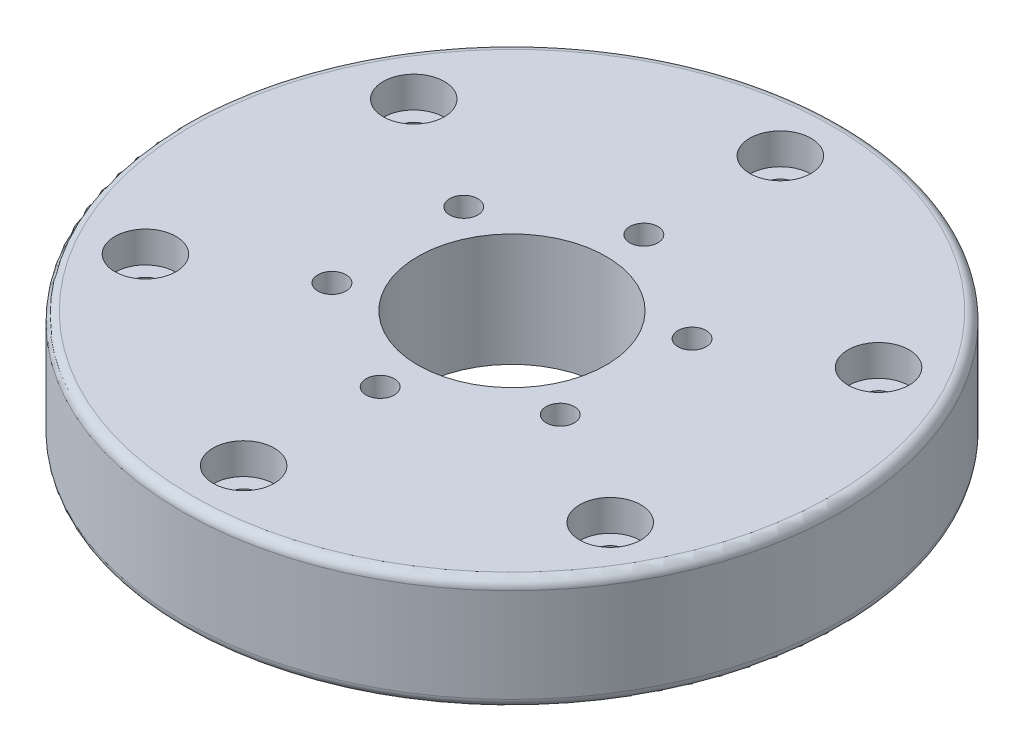
ISO-10303-21;
HEADER;
FILE_DESCRIPTION(('STEP AP214'),'2;1');
FILE_NAME('part.step','',(''),(''),'','','');
FILE_SCHEMA(('AUTOMOTIVE_DESIGN { 1 0 10303 214 1 1 1 1 }'));
ENDSEC;
DATA;
#1=APPLICATION_CONTEXT('core data for automotive mechanical design processes');
#2=APPLICATION_PROTOCOL_DEFINITION('international standard','automotive_design',2000,#1);
#3=PRODUCT_CONTEXT('',#1,'mechanical');
#4=PRODUCT('Part','Part','',(#3));
#5=PRODUCT_RELATED_PRODUCT_CATEGORY('part','',(#4));
#6=PRODUCT_DEFINITION_FORMATION('','',#4);
#7=PRODUCT_DEFINITION_CONTEXT('part definition',#1,'design');
#8=PRODUCT_DEFINITION('design','',#6,#7);
#9=PRODUCT_DEFINITION_SHAPE('','',#8);
#10=(LENGTH_UNIT() NAMED_UNIT(*) SI_UNIT(.MILLI.,.METRE.));
#11=(NAMED_UNIT(*) PLANE_ANGLE_UNIT() SI_UNIT($,.RADIAN.));
#12=(NAMED_UNIT(*) SI_UNIT($,.STERADIAN.) SOLID_ANGLE_UNIT());
#13=UNCERTAINTY_MEASURE_WITH_UNIT(LENGTH_MEASURE(1.E-05),#10,'distance_accuracy_value','');
#14=(GEOMETRIC_REPRESENTATION_CONTEXT(3) GLOBAL_UNCERTAINTY_ASSIGNED_CONTEXT((#13)) GLOBAL_UNIT_ASSIGNED_CONTEXT((#10,
#11,#12)) REPRESENTATION_CONTEXT('',''));
#15=CARTESIAN_POINT('',(0.,0.,0.));
#16=DIRECTION('',(0.,0.,1.));
#17=DIRECTION('',(1.,0.,0.));
#18=AXIS2_PLACEMENT_3D('',#15,#16,#17);
#19=CARTESIAN_POINT('',(24.6817240078563,8.7,-14.2500000000003));
#20=DIRECTION('',(0.,-1.,0.));
#21=DIRECTION('',(0.,0.,-1.));
#22=AXIS2_PLACEMENT_3D('',#19,#20,#21);
#23=PLANE('',#22);
#24=CARTESIAN_POINT('',(24.6817240078563,8.7,-14.2500000000003));
#25=DIRECTION('',(0.,1.,0.));
#26=DIRECTION('',(0.,0.,1.));
#27=AXIS2_PLACEMENT_3D('',#24,#25,#26);
#28=CIRCLE('',#27,3.25000000000001);
#29=CARTESIAN_POINT('',(24.6817240078563,8.7,-11.0000000000003));
#30=VERTEX_POINT('',#29);
#31=EDGE_CURVE('E87',#30,#30,#28,.T.);
#32=ORIENTED_EDGE('',*,*,#31,.T.);
#33=EDGE_LOOP('',(#32));
#34=FACE_BOUND('',#33,.T.);
#35=CARTESIAN_POINT('',(24.6817240078563,8.7,-14.2500000000003));
#36=DIRECTION('',(0.,1.,0.));
#37=DIRECTION('',(0.,0.,1.));
#38=AXIS2_PLACEMENT_3D('',#35,#36,#37);
#39=CIRCLE('',#38,1.65000000000001);
#40=CARTESIAN_POINT('',(24.6817240078563,8.7,-12.6000000000003));
#41=VERTEX_POINT('',#40);
#42=EDGE_CURVE('E126',#41,#41,#39,.T.);
#43=ORIENTED_EDGE('',*,*,#42,.F.);
#44=EDGE_LOOP('',(#43));
#45=FACE_BOUND('',#44,.T.);
#46=ADVANCED_FACE('F37',(#34,#45),#23,.F.);
#47=CARTESIAN_POINT('',(24.6817240078566,8.7,14.2499999999998));
#48=DIRECTION('',(0.,-1.,0.));
#49=DIRECTION('',(0.,0.,-1.));
#50=AXIS2_PLACEMENT_3D('',#47,#48,#49);
#51=PLANE('',#50);
#52=CARTESIAN_POINT('',(24.6817240078566,8.7,14.2499999999998));
#53=DIRECTION('',(0.,1.,0.));
#54=DIRECTION('',(0.,0.,1.));
#55=AXIS2_PLACEMENT_3D('',#52,#53,#54);
#56=CIRCLE('',#55,3.25000000000001);
#57=CARTESIAN_POINT('',(24.6817240078566,8.7,17.4999999999998));
#58=VERTEX_POINT('',#57);
#59=EDGE_CURVE('E81',#58,#58,#56,.T.);
#60=ORIENTED_EDGE('',*,*,#59,.T.);
#61=EDGE_LOOP('',(#60));
#62=FACE_BOUND('',#61,.T.);
#63=CARTESIAN_POINT('',(24.6817240078566,8.7,14.2499999999998));
#64=DIRECTION('',(0.,1.,0.));
#65=DIRECTION('',(0.,0.,1.));
#66=AXIS2_PLACEMENT_3D('',#63,#64,#65);
#67=CIRCLE('',#66,1.65000000000001);
#68=CARTESIAN_POINT('',(24.6817240078566,8.7,15.8999999999998));
#69=VERTEX_POINT('',#68);
#70=EDGE_CURVE('E120',#69,#69,#67,.T.);
#71=ORIENTED_EDGE('',*,*,#70,.F.);
#72=EDGE_LOOP('',(#71));
#73=FACE_BOUND('',#72,.T.);
#74=ADVANCED_FACE('F222',(#62,#73),#51,.F.);
#75=CARTESIAN_POINT('',(0.,8.7,28.5));
#76=DIRECTION('',(0.,-1.,0.));
#77=DIRECTION('',(0.,0.,-1.));
#78=AXIS2_PLACEMENT_3D('',#75,#76,#77);
#79=PLANE('',#78);
#80=CARTESIAN_POINT('',(0.,8.7,28.5));
#81=DIRECTION('',(0.,1.,0.));
#82=DIRECTION('',(0.,0.,1.));
#83=AXIS2_PLACEMENT_3D('',#80,#81,#82);
#84=CIRCLE('',#83,3.25000000000001);
#85=CARTESIAN_POINT('',(0.,8.7,31.75));
#86=VERTEX_POINT('',#85);
#87=EDGE_CURVE('E75',#86,#86,#84,.T.);
#88=ORIENTED_EDGE('',*,*,#87,.T.);
#89=EDGE_LOOP('',(#88));
#90=FACE_BOUND('',#89,.T.);
#91=CARTESIAN_POINT('',(0.,8.7,28.5));
#92=DIRECTION('',(0.,1.,0.));
#93=DIRECTION('',(0.,0.,1.));
#94=AXIS2_PLACEMENT_3D('',#91,#92,#93);
#95=CIRCLE('',#94,1.65000000000001);
#96=CARTESIAN_POINT('',(0.,8.7,30.15));
#97=VERTEX_POINT('',#96);
#98=EDGE_CURVE('E114',#97,#97,#95,.T.);
#99=ORIENTED_EDGE('',*,*,#98,.F.);
#100=EDGE_LOOP('',(#99));
#101=FACE_BOUND('',#100,.T.);
#102=ADVANCED_FACE('F229',(#90,#101),#79,.F.);
#103=CARTESIAN_POINT('',(-24.6817240078564,8.7,14.2500000000001));
#104=DIRECTION('',(0.,-1.,0.));
#105=DIRECTION('',(0.,0.,-1.));
#106=AXIS2_PLACEMENT_3D('',#103,#104,#105);
#107=PLANE('',#106);
#108=CARTESIAN_POINT('',(-24.6817240078564,8.7,14.2500000000001));
#109=DIRECTION('',(0.,1.,0.));
#110=DIRECTION('',(0.,0.,1.));
#111=AXIS2_PLACEMENT_3D('',#108,#109,#110);
#112=CIRCLE('',#111,3.25000000000001);
#113=CARTESIAN_POINT('',(-24.6817240078564,8.7,17.5000000000001));
#114=VERTEX_POINT('',#113);
#115=EDGE_CURVE('E69',#114,#114,#112,.T.);
#116=ORIENTED_EDGE('',*,*,#115,.T.);
#117=EDGE_LOOP('',(#116));
#118=FACE_BOUND('',#117,.T.);
#119=CARTESIAN_POINT('',(-24.6817240078564,8.7,14.2500000000001));
#120=DIRECTION('',(0.,1.,0.));
#121=DIRECTION('',(0.,0.,1.));
#122=AXIS2_PLACEMENT_3D('',#119,#120,#121);
#123=CIRCLE('',#122,1.65000000000001);
#124=CARTESIAN_POINT('',(-24.6817240078564,8.7,15.9000000000001));
#125=VERTEX_POINT('',#124);
#126=EDGE_CURVE('E108',#125,#125,#123,.T.);
#127=ORIENTED_EDGE('',*,*,#126,.F.);
#128=EDGE_LOOP('',(#127));
#129=FACE_BOUND('',#128,.T.);
#130=ADVANCED_FACE('F247',(#118,#129),#107,.F.);
#131=CARTESIAN_POINT('',(-24.6817240078565,8.7,-14.2499999999999));
#132=DIRECTION('',(0.,-1.,0.));
#133=DIRECTION('',(0.,0.,-1.));
#134=AXIS2_PLACEMENT_3D('',#131,#132,#133);
#135=PLANE('',#134);
#136=CARTESIAN_POINT('',(-24.6817240078565,8.7,-14.2499999999999));
#137=DIRECTION('',(0.,1.,0.));
#138=DIRECTION('',(0.,0.,1.));
#139=AXIS2_PLACEMENT_3D('',#136,#137,#138);
#140=CIRCLE('',#139,3.25000000000001);
#141=CARTESIAN_POINT('',(-24.6817240078565,8.7,-10.9999999999999));
#142=VERTEX_POINT('',#141);
#143=EDGE_CURVE('E63',#142,#142,#140,.T.);
#144=ORIENTED_EDGE('',*,*,#143,.T.);
#145=EDGE_LOOP('',(#144));
#146=FACE_BOUND('',#145,.T.);
#147=CARTESIAN_POINT('',(-24.6817240078565,8.7,-14.2499999999999));
#148=DIRECTION('',(0.,1.,0.));
#149=DIRECTION('',(0.,0.,1.));
#150=AXIS2_PLACEMENT_3D('',#147,#148,#149);
#151=CIRCLE('',#150,1.65000000000001);
#152=CARTESIAN_POINT('',(-24.6817240078565,8.7,-12.5999999999999));
#153=VERTEX_POINT('',#152);
#154=EDGE_CURVE('E102',#153,#153,#151,.T.);
#155=ORIENTED_EDGE('',*,*,#154,.F.);
#156=EDGE_LOOP('',(#155));
#157=FACE_BOUND('',#156,.T.);
#158=ADVANCED_FACE('F253',(#146,#157),#135,.F.);
#159=CARTESIAN_POINT('',(0.,12.,0.));
#160=DIRECTION('',(0.,-1.,0.));
#161=DIRECTION('',(0.,0.,-1.));
#162=AXIS2_PLACEMENT_3D('',#159,#160,#161);
#163=CYLINDRICAL_SURFACE('',#162,35.);
#164=CARTESIAN_POINT('',(0.,1.,0.));
#165=DIRECTION('',(0.,1.,0.));
#166=DIRECTION('',(0.,0.,1.));
#167=AXIS2_PLACEMENT_3D('',#164,#165,#166);
#168=CIRCLE('',#167,35.);
#169=CARTESIAN_POINT('',(0.,1.,35.));
#170=VERTEX_POINT('',#169);
#171=EDGE_CURVE('E48',#170,#170,#168,.T.);
#172=ORIENTED_EDGE('',*,*,#171,.T.);
#173=EDGE_LOOP('',(#172));
#174=FACE_BOUND('',#173,.T.);
#175=CARTESIAN_POINT('',(0.,11.,0.));
#176=DIRECTION('',(0.,1.,0.));
#177=DIRECTION('',(0.,0.,1.));
#178=AXIS2_PLACEMENT_3D('',#175,#176,#177);
#179=CIRCLE('',#178,35.);
#180=CARTESIAN_POINT('',(0.,11.,35.));
#181=VERTEX_POINT('',#180);
#182=EDGE_CURVE('E52',#181,#181,#179,.F.);
#183=ORIENTED_EDGE('',*,*,#182,.T.);
#184=EDGE_LOOP('',(#183));
#185=FACE_BOUND('',#184,.T.);
#186=ADVANCED_FACE('F177',(#174,#185),#163,.T.);
#187=CARTESIAN_POINT('',(0.,12.,0.));
#188=DIRECTION('',(0.,1.,0.));
#189=DIRECTION('',(0.,0.,1.));
#190=AXIS2_PLACEMENT_3D('',#187,#188,#189);
#191=PLANE('',#190);
#192=CARTESIAN_POINT('',(0.,12.,0.));
#193=DIRECTION('',(0.,1.,0.));
#194=DIRECTION('',(0.,0.,1.));
#195=AXIS2_PLACEMENT_3D('',#192,#193,#194);
#196=CIRCLE('',#195,10.);
#197=CARTESIAN_POINT('',(0.,12.,10.));
#198=VERTEX_POINT('',#197);
#199=EDGE_CURVE('E168',#198,#198,#196,.T.);
#200=ORIENTED_EDGE('',*,*,#199,.F.);
#201=EDGE_LOOP('',(#200));
#202=FACE_BOUND('',#201,.T.);
#203=CARTESIAN_POINT('',(0.,12.,0.));
#204=DIRECTION('',(0.,1.,0.));
#205=DIRECTION('',(0.,0.,1.));
#206=AXIS2_PLACEMENT_3D('',#203,#204,#205);
#207=CIRCLE('',#206,34.);
#208=CARTESIAN_POINT('',(0.,12.,34.));
#209=VERTEX_POINT('',#208);
#210=EDGE_CURVE('E10',#209,#209,#207,.T.);
#211=ORIENTED_EDGE('',*,*,#210,.T.);
#212=EDGE_LOOP('',(#211));
#213=FACE_BOUND('',#212,.T.);
#214=CARTESIAN_POINT('',(12.1243556529821,12.,-7.00000000000014));
#215=DIRECTION('',(0.,1.,0.));
#216=DIRECTION('',(0.,0.,1.));
#217=AXIS2_PLACEMENT_3D('',#214,#215,#216);
#218=CIRCLE('',#217,1.50000000000001);
#219=CARTESIAN_POINT('',(12.1243556529821,12.,-5.50000000000013));
#220=VERTEX_POINT('',#219);
#221=EDGE_CURVE('E162',#220,#220,#218,.T.);
#222=ORIENTED_EDGE('',*,*,#221,.F.);
#223=EDGE_LOOP('',(#222));
#224=FACE_BOUND('',#223,.T.);
#225=CARTESIAN_POINT('',(12.1243556529822,12.,6.99999999999989));
#226=DIRECTION('',(0.,1.,0.));
#227=DIRECTION('',(0.,0.,1.));
#228=AXIS2_PLACEMENT_3D('',#225,#226,#227);
#229=CIRCLE('',#228,1.50000000000001);
#230=CARTESIAN_POINT('',(12.1243556529822,12.,8.4999999999999));
#231=VERTEX_POINT('',#230);
#232=EDGE_CURVE('E156',#231,#231,#229,.T.);
#233=ORIENTED_EDGE('',*,*,#232,.F.);
#234=EDGE_LOOP('',(#233));
#235=FACE_BOUND('',#234,.T.);
#236=CARTESIAN_POINT('',(0.,12.,14.));
#237=DIRECTION('',(0.,1.,0.));
#238=DIRECTION('',(0.,0.,1.));
#239=AXIS2_PLACEMENT_3D('',#236,#237,#238);
#240=CIRCLE('',#239,1.50000000000001);
#241=CARTESIAN_POINT('',(0.,12.,15.5));
#242=VERTEX_POINT('',#241);
#243=EDGE_CURVE('E150',#242,#242,#240,.T.);
#244=ORIENTED_EDGE('',*,*,#243,.F.);
#245=EDGE_LOOP('',(#244));
#246=FACE_BOUND('',#245,.T.);
#247=CARTESIAN_POINT('',(-12.1243556529821,12.,7.00000000000006));
#248=DIRECTION('',(0.,1.,0.));
#249=DIRECTION('',(0.,0.,1.));
#250=AXIS2_PLACEMENT_3D('',#247,#248,#249);
#251=CIRCLE('',#250,1.50000000000001);
#252=CARTESIAN_POINT('',(-12.1243556529821,12.,8.50000000000007));
#253=VERTEX_POINT('',#252);
#254=EDGE_CURVE('E144',#253,#253,#251,.T.);
#255=ORIENTED_EDGE('',*,*,#254,.F.);
#256=EDGE_LOOP('',(#255));
#257=FACE_BOUND('',#256,.T.);
#258=CARTESIAN_POINT('',(-12.1243556529822,12.,-6.99999999999997));
#259=DIRECTION('',(0.,1.,0.));
#260=DIRECTION('',(0.,0.,1.));
#261=AXIS2_PLACEMENT_3D('',#258,#259,#260);
#262=CIRCLE('',#261,1.50000000000001);
#263=CARTESIAN_POINT('',(-12.1243556529822,12.,-5.49999999999996));
#264=VERTEX_POINT('',#263);
#265=EDGE_CURVE('E138',#264,#264,#262,.T.);
#266=ORIENTED_EDGE('',*,*,#265,.F.);
#267=EDGE_LOOP('',(#266));
#268=FACE_BOUND('',#267,.T.);
#269=CARTESIAN_POINT('',(0.,12.,-14.));
#270=DIRECTION('',(0.,1.,0.));
#271=DIRECTION('',(0.,0.,1.));
#272=AXIS2_PLACEMENT_3D('',#269,#270,#271);
#273=CIRCLE('',#272,1.50000000000001);
#274=CARTESIAN_POINT('',(0.,12.,-12.5));
#275=VERTEX_POINT('',#274);
#276=EDGE_CURVE('E132',#275,#275,#273,.T.);
#277=ORIENTED_EDGE('',*,*,#276,.F.);
#278=EDGE_LOOP('',(#277));
#279=FACE_BOUND('',#278,.T.);
#280=CARTESIAN_POINT('',(24.6817240078563,12.,-14.2500000000003));
#281=DIRECTION('',(0.,1.,0.));
#282=DIRECTION('',(0.,0.,1.));
#283=AXIS2_PLACEMENT_3D('',#280,#281,#282);
#284=CIRCLE('',#283,3.25000000000001);
#285=CARTESIAN_POINT('',(24.6817240078563,12.,-11.0000000000003));
#286=VERTEX_POINT('',#285);
#287=EDGE_CURVE('E90',#286,#286,#284,.T.);
#288=ORIENTED_EDGE('',*,*,#287,.F.);
#289=EDGE_LOOP('',(#288));
#290=FACE_BOUND('',#289,.T.);
#291=CARTESIAN_POINT('',(24.6817240078566,12.,14.2499999999998));
#292=DIRECTION('',(0.,1.,0.));
#293=DIRECTION('',(0.,0.,1.));
#294=AXIS2_PLACEMENT_3D('',#291,#292,#293);
#295=CIRCLE('',#294,3.25000000000001);
#296=CARTESIAN_POINT('',(24.6817240078566,12.,17.4999999999998));
#297=VERTEX_POINT('',#296);
#298=EDGE_CURVE('E84',#297,#297,#295,.T.);
#299=ORIENTED_EDGE('',*,*,#298,.F.);
#300=EDGE_LOOP('',(#299));
#301=FACE_BOUND('',#300,.T.);
#302=CARTESIAN_POINT('',(0.,12.,28.5));
#303=DIRECTION('',(0.,1.,0.));
#304=DIRECTION('',(0.,0.,1.));
#305=AXIS2_PLACEMENT_3D('',#302,#303,#304);
#306=CIRCLE('',#305,3.25000000000001);
#307=CARTESIAN_POINT('',(0.,12.,31.75));
#308=VERTEX_POINT('',#307);
#309=EDGE_CURVE('E78',#308,#308,#306,.T.);
#310=ORIENTED_EDGE('',*,*,#309,.F.);
#311=EDGE_LOOP('',(#310));
#312=FACE_BOUND('',#311,.T.);
#313=CARTESIAN_POINT('',(-24.6817240078564,12.,14.2500000000001));
#314=DIRECTION('',(0.,1.,0.));
#315=DIRECTION('',(0.,0.,1.));
#316=AXIS2_PLACEMENT_3D('',#313,#314,#315);
#317=CIRCLE('',#316,3.25000000000001);
#318=CARTESIAN_POINT('',(-24.6817240078564,12.,17.5000000000001));
#319=VERTEX_POINT('',#318);
#320=EDGE_CURVE('E72',#319,#319,#317,.T.);
#321=ORIENTED_EDGE('',*,*,#320,.F.);
#322=EDGE_LOOP('',(#321));
#323=FACE_BOUND('',#322,.T.);
#324=CARTESIAN_POINT('',(-24.6817240078565,12.,-14.2499999999999));
#325=DIRECTION('',(0.,1.,0.));
#326=DIRECTION('',(0.,0.,1.));
#327=AXIS2_PLACEMENT_3D('',#324,#325,#326);
#328=CIRCLE('',#327,3.25000000000001);
#329=CARTESIAN_POINT('',(-24.6817240078565,12.,-10.9999999999999));
#330=VERTEX_POINT('',#329);
#331=EDGE_CURVE('E66',#330,#330,#328,.T.);
#332=ORIENTED_EDGE('',*,*,#331,.F.);
#333=EDGE_LOOP('',(#332));
#334=FACE_BOUND('',#333,.T.);
#335=CARTESIAN_POINT('',(0.,12.,-28.5));
#336=DIRECTION('',(0.,1.,0.));
#337=DIRECTION('',(0.,0.,1.));
#338=AXIS2_PLACEMENT_3D('',#335,#336,#337);
#339=CIRCLE('',#338,3.25000000000001);
#340=CARTESIAN_POINT('',(0.,12.,-25.25));
#341=VERTEX_POINT('',#340);
#342=EDGE_CURVE('E60',#341,#341,#339,.T.);
#343=ORIENTED_EDGE('',*,*,#342,.F.);
#344=EDGE_LOOP('',(#343));
#345=FACE_BOUND('',#344,.T.);
#346=ADVANCED_FACE('F174',(#202,#213,#224,#235,#246,#257,#268,#279,#290,#301,#312,#323,#334,
#345),#191,.T.);
#347=CARTESIAN_POINT('',(0.,0.,0.));
#348=DIRECTION('',(0.,1.,0.));
#349=DIRECTION('',(0.,0.,1.));
#350=AXIS2_PLACEMENT_3D('',#347,#348,#349);
#351=PLANE('',#350);
#352=CARTESIAN_POINT('',(0.,0.,0.));
#353=DIRECTION('',(0.,1.,0.));
#354=DIRECTION('',(0.,0.,1.));
#355=AXIS2_PLACEMENT_3D('',#352,#353,#354);
#356=CIRCLE('',#355,10.);
#357=CARTESIAN_POINT('',(0.,0.,10.));
#358=VERTEX_POINT('',#357);
#359=EDGE_CURVE('E165',#358,#358,#356,.T.);
#360=ORIENTED_EDGE('',*,*,#359,.T.);
#361=EDGE_LOOP('',(#360));
#362=FACE_BOUND('',#361,.T.);
#363=CARTESIAN_POINT('',(0.,0.,0.));
#364=DIRECTION('',(0.,1.,0.));
#365=DIRECTION('',(0.,0.,1.));
#366=AXIS2_PLACEMENT_3D('',#363,#364,#365);
#367=CIRCLE('',#366,34.);
#368=CARTESIAN_POINT('',(0.,0.,34.));
#369=VERTEX_POINT('',#368);
#370=EDGE_CURVE('E44',#369,#369,#367,.F.);
#371=ORIENTED_EDGE('',*,*,#370,.T.);
#372=EDGE_LOOP('',(#371));
#373=FACE_BOUND('',#372,.T.);
#374=CARTESIAN_POINT('',(12.1243556529821,0.,-7.00000000000014));
#375=DIRECTION('',(0.,1.,0.));
#376=DIRECTION('',(0.,0.,1.));
#377=AXIS2_PLACEMENT_3D('',#374,#375,#376);
#378=CIRCLE('',#377,1.50000000000001);
#379=CARTESIAN_POINT('',(12.1243556529821,0.,-5.50000000000013));
#380=VERTEX_POINT('',#379);
#381=EDGE_CURVE('E159',#380,#380,#378,.T.);
#382=ORIENTED_EDGE('',*,*,#381,.T.);
#383=EDGE_LOOP('',(#382));
#384=FACE_BOUND('',#383,.T.);
#385=CARTESIAN_POINT('',(12.1243556529822,0.,6.99999999999989));
#386=DIRECTION('',(0.,1.,0.));
#387=DIRECTION('',(0.,0.,1.));
#388=AXIS2_PLACEMENT_3D('',#385,#386,#387);
#389=CIRCLE('',#388,1.50000000000001);
#390=CARTESIAN_POINT('',(12.1243556529822,0.,8.4999999999999));
#391=VERTEX_POINT('',#390);
#392=EDGE_CURVE('E153',#391,#391,#389,.T.);
#393=ORIENTED_EDGE('',*,*,#392,.T.);
#394=EDGE_LOOP('',(#393));
#395=FACE_BOUND('',#394,.T.);
#396=CARTESIAN_POINT('',(0.,0.,14.));
#397=DIRECTION('',(0.,1.,0.));
#398=DIRECTION('',(0.,0.,1.));
#399=AXIS2_PLACEMENT_3D('',#396,#397,#398);
#400=CIRCLE('',#399,1.50000000000001);
#401=CARTESIAN_POINT('',(0.,0.,15.5));
#402=VERTEX_POINT('',#401);
#403=EDGE_CURVE('E147',#402,#402,#400,.T.);
#404=ORIENTED_EDGE('',*,*,#403,.T.);
#405=EDGE_LOOP('',(#404));
#406=FACE_BOUND('',#405,.T.);
#407=CARTESIAN_POINT('',(-12.1243556529821,0.,7.00000000000006));
#408=DIRECTION('',(0.,1.,0.));
#409=DIRECTION('',(0.,0.,1.));
#410=AXIS2_PLACEMENT_3D('',#407,#408,#409);
#411=CIRCLE('',#410,1.50000000000001);
#412=CARTESIAN_POINT('',(-12.1243556529821,0.,8.50000000000007));
#413=VERTEX_POINT('',#412);
#414=EDGE_CURVE('E141',#413,#413,#411,.T.);
#415=ORIENTED_EDGE('',*,*,#414,.T.);
#416=EDGE_LOOP('',(#415));
#417=FACE_BOUND('',#416,.T.);
#418=CARTESIAN_POINT('',(-12.1243556529822,0.,-6.99999999999997));
#419=DIRECTION('',(0.,1.,0.));
#420=DIRECTION('',(0.,0.,1.));
#421=AXIS2_PLACEMENT_3D('',#418,#419,#420);
#422=CIRCLE('',#421,1.50000000000001);
#423=CARTESIAN_POINT('',(-12.1243556529822,0.,-5.49999999999996));
#424=VERTEX_POINT('',#423);
#425=EDGE_CURVE('E135',#424,#424,#422,.T.);
#426=ORIENTED_EDGE('',*,*,#425,.T.);
#427=EDGE_LOOP('',(#426));
#428=FACE_BOUND('',#427,.T.);
#429=CARTESIAN_POINT('',(0.,0.,-14.));
#430=DIRECTION('',(0.,1.,0.));
#431=DIRECTION('',(0.,0.,1.));
#432=AXIS2_PLACEMENT_3D('',#429,#430,#431);
#433=CIRCLE('',#432,1.50000000000001);
#434=CARTESIAN_POINT('',(0.,0.,-12.5));
#435=VERTEX_POINT('',#434);
#436=EDGE_CURVE('E129',#435,#435,#433,.T.);
#437=ORIENTED_EDGE('',*,*,#436,.T.);
#438=EDGE_LOOP('',(#437));
#439=FACE_BOUND('',#438,.T.);
#440=CARTESIAN_POINT('',(24.6817240078563,0.,-14.2500000000003));
#441=DIRECTION('',(0.,1.,0.));
#442=DIRECTION('',(0.,0.,1.));
#443=AXIS2_PLACEMENT_3D('',#440,#441,#442);
#444=CIRCLE('',#443,1.65000000000001);
#445=CARTESIAN_POINT('',(24.6817240078563,0.,-12.6000000000003));
#446=VERTEX_POINT('',#445);
#447=EDGE_CURVE('E123',#446,#446,#444,.T.);
#448=ORIENTED_EDGE('',*,*,#447,.T.);
#449=EDGE_LOOP('',(#448));
#450=FACE_BOUND('',#449,.T.);
#451=CARTESIAN_POINT('',(24.6817240078566,0.,14.2499999999998));
#452=DIRECTION('',(0.,1.,0.));
#453=DIRECTION('',(0.,0.,1.));
#454=AXIS2_PLACEMENT_3D('',#451,#452,#453);
#455=CIRCLE('',#454,1.65000000000001);
#456=CARTESIAN_POINT('',(24.6817240078566,0.,15.8999999999998));
#457=VERTEX_POINT('',#456);
#458=EDGE_CURVE('E117',#457,#457,#455,.T.);
#459=ORIENTED_EDGE('',*,*,#458,.T.);
#460=EDGE_LOOP('',(#459));
#461=FACE_BOUND('',#460,.T.);
#462=CARTESIAN_POINT('',(0.,0.,28.5));
#463=DIRECTION('',(0.,1.,0.));
#464=DIRECTION('',(0.,0.,1.));
#465=AXIS2_PLACEMENT_3D('',#462,#463,#464);
#466=CIRCLE('',#465,1.65000000000001);
#467=CARTESIAN_POINT('',(0.,0.,30.15));
#468=VERTEX_POINT('',#467);
#469=EDGE_CURVE('E111',#468,#468,#466,.T.);
#470=ORIENTED_EDGE('',*,*,#469,.T.);
#471=EDGE_LOOP('',(#470));
#472=FACE_BOUND('',#471,.T.);
#473=CARTESIAN_POINT('',(-24.6817240078564,0.,14.2500000000001));
#474=DIRECTION('',(0.,1.,0.));
#475=DIRECTION('',(0.,0.,1.));
#476=AXIS2_PLACEMENT_3D('',#473,#474,#475);
#477=CIRCLE('',#476,1.65000000000001);
#478=CARTESIAN_POINT('',(-24.6817240078564,0.,15.9000000000001));
#479=VERTEX_POINT('',#478);
#480=EDGE_CURVE('E105',#479,#479,#477,.T.);
#481=ORIENTED_EDGE('',*,*,#480,.T.);
#482=EDGE_LOOP('',(#481));
#483=FACE_BOUND('',#482,.T.);
#484=CARTESIAN_POINT('',(-24.6817240078565,0.,-14.2499999999999));
#485=DIRECTION('',(0.,1.,0.));
#486=DIRECTION('',(0.,0.,1.));
#487=AXIS2_PLACEMENT_3D('',#484,#485,#486);
#488=CIRCLE('',#487,1.65000000000001);
#489=CARTESIAN_POINT('',(-24.6817240078565,0.,-12.5999999999999));
#490=VERTEX_POINT('',#489);
#491=EDGE_CURVE('E99',#490,#490,#488,.T.);
#492=ORIENTED_EDGE('',*,*,#491,.T.);
#493=EDGE_LOOP('',(#492));
#494=FACE_BOUND('',#493,.T.);
#495=CARTESIAN_POINT('',(0.,0.,-28.5));
#496=DIRECTION('',(0.,1.,0.));
#497=DIRECTION('',(0.,0.,1.));
#498=AXIS2_PLACEMENT_3D('',#495,#496,#497);
#499=CIRCLE('',#498,1.65000000000001);
#500=CARTESIAN_POINT('',(0.,0.,-26.85));
#501=VERTEX_POINT('',#500);
#502=EDGE_CURVE('E93',#501,#501,#499,.T.);
#503=ORIENTED_EDGE('',*,*,#502,.T.);
#504=EDGE_LOOP('',(#503));
#505=FACE_BOUND('',#504,.T.);
#506=ADVANCED_FACE('F176',(#362,#373,#384,#395,#406,#417,#428,#439,#450,#461,#472,#483,#494,
#505),#351,.F.);
#507=CARTESIAN_POINT('',(0.,8.7,-28.5));
#508=DIRECTION('',(0.,-1.,0.));
#509=DIRECTION('',(0.,0.,-1.));
#510=AXIS2_PLACEMENT_3D('',#507,#508,#509);
#511=PLANE('',#510);
#512=CARTESIAN_POINT('',(0.,8.7,-28.5));
#513=DIRECTION('',(0.,1.,0.));
#514=DIRECTION('',(0.,0.,1.));
#515=AXIS2_PLACEMENT_3D('',#512,#513,#514);
#516=CIRCLE('',#515,1.65000000000001);
#517=CARTESIAN_POINT('',(0.,8.7,-26.85));
#518=VERTEX_POINT('',#517);
#519=EDGE_CURVE('E96',#518,#518,#516,.T.);
#520=ORIENTED_EDGE('',*,*,#519,.F.);
#521=EDGE_LOOP('',(#520));
#522=FACE_BOUND('',#521,.T.);
#523=CARTESIAN_POINT('',(0.,8.7,-28.5));
#524=DIRECTION('',(0.,1.,0.));
#525=DIRECTION('',(0.,0.,1.));
#526=AXIS2_PLACEMENT_3D('',#523,#524,#525);
#527=CIRCLE('',#526,3.25000000000001);
#528=CARTESIAN_POINT('',(0.,8.7,-25.25));
#529=VERTEX_POINT('',#528);
#530=EDGE_CURVE('E57',#529,#529,#527,.T.);
#531=ORIENTED_EDGE('',*,*,#530,.T.);
#532=EDGE_LOOP('',(#531));
#533=FACE_BOUND('',#532,.T.);
#534=ADVANCED_FACE('F207',(#522,#533),#511,.F.);
#535=CARTESIAN_POINT('',(0.,12.,-28.5));
#536=DIRECTION('',(0.,1.,0.));
#537=DIRECTION('',(0.,0.,1.));
#538=AXIS2_PLACEMENT_3D('',#535,#536,#537);
#539=CYLINDRICAL_SURFACE('',#538,3.25000000000001);
#540=ORIENTED_EDGE('',*,*,#530,.F.);
#541=EDGE_LOOP('',(#540));
#542=FACE_BOUND('',#541,.T.);
#543=ORIENTED_EDGE('',*,*,#342,.T.);
#544=EDGE_LOOP('',(#543));
#545=FACE_BOUND('',#544,.T.);
#546=ADVANCED_FACE('F204',(#542,#545),#539,.F.);
#547=CARTESIAN_POINT('',(-24.6817240078565,12.,-14.2499999999999));
#548=DIRECTION('',(0.,1.,0.));
#549=DIRECTION('',(0.,0.,1.));
#550=AXIS2_PLACEMENT_3D('',#547,#548,#549);
#551=CYLINDRICAL_SURFACE('',#550,3.25000000000001);
#552=ORIENTED_EDGE('',*,*,#143,.F.);
#553=EDGE_LOOP('',(#552));
#554=FACE_BOUND('',#553,.T.);
#555=ORIENTED_EDGE('',*,*,#331,.T.);
#556=EDGE_LOOP('',(#555));
#557=FACE_BOUND('',#556,.T.);
#558=ADVANCED_FACE('F206',(#554,#557),#551,.F.);
#559=CARTESIAN_POINT('',(-24.6817240078564,12.,14.2500000000001));
#560=DIRECTION('',(0.,1.,0.));
#561=DIRECTION('',(0.,0.,1.));
#562=AXIS2_PLACEMENT_3D('',#559,#560,#561);
#563=CYLINDRICAL_SURFACE('',#562,3.25000000000001);
#564=ORIENTED_EDGE('',*,*,#115,.F.);
#565=EDGE_LOOP('',(#564));
#566=FACE_BOUND('',#565,.T.);
#567=ORIENTED_EDGE('',*,*,#320,.T.);
#568=EDGE_LOOP('',(#567));
#569=FACE_BOUND('',#568,.T.);
#570=ADVANCED_FACE('F213',(#566,#569),#563,.F.);
#571=CARTESIAN_POINT('',(0.,12.,28.5));
#572=DIRECTION('',(0.,1.,0.));
#573=DIRECTION('',(0.,0.,1.));
#574=AXIS2_PLACEMENT_3D('',#571,#572,#573);
#575=CYLINDRICAL_SURFACE('',#574,3.25000000000001);
#576=ORIENTED_EDGE('',*,*,#87,.F.);
#577=EDGE_LOOP('',(#576));
#578=FACE_BOUND('',#577,.T.);
#579=ORIENTED_EDGE('',*,*,#309,.T.);
#580=EDGE_LOOP('',(#579));
#581=FACE_BOUND('',#580,.T.);
#582=ADVANCED_FACE('F239',(#578,#581),#575,.F.);
#583=CARTESIAN_POINT('',(24.6817240078566,12.,14.2499999999998));
#584=DIRECTION('',(0.,1.,0.));
#585=DIRECTION('',(0.,0.,1.));
#586=AXIS2_PLACEMENT_3D('',#583,#584,#585);
#587=CYLINDRICAL_SURFACE('',#586,3.25000000000001);
#588=ORIENTED_EDGE('',*,*,#59,.F.);
#589=EDGE_LOOP('',(#588));
#590=FACE_BOUND('',#589,.T.);
#591=ORIENTED_EDGE('',*,*,#298,.T.);
#592=EDGE_LOOP('',(#591));
#593=FACE_BOUND('',#592,.T.);
#594=ADVANCED_FACE('F237',(#590,#593),#587,.F.);
#595=CARTESIAN_POINT('',(24.6817240078563,12.,-14.2500000000003));
#596=DIRECTION('',(0.,1.,0.));
#597=DIRECTION('',(0.,0.,1.));
#598=AXIS2_PLACEMENT_3D('',#595,#596,#597);
#599=CYLINDRICAL_SURFACE('',#598,3.25000000000001);
#600=ORIENTED_EDGE('',*,*,#31,.F.);
#601=EDGE_LOOP('',(#600));
#602=FACE_BOUND('',#601,.T.);
#603=ORIENTED_EDGE('',*,*,#287,.T.);
#604=EDGE_LOOP('',(#603));
#605=FACE_BOUND('',#604,.T.);
#606=ADVANCED_FACE('F235',(#602,#605),#599,.F.);
#607=CARTESIAN_POINT('',(0.,8.7,-28.5));
#608=DIRECTION('',(0.,1.,0.));
#609=DIRECTION('',(0.,0.,1.));
#610=AXIS2_PLACEMENT_3D('',#607,#608,#609);
#611=CYLINDRICAL_SURFACE('',#610,1.65000000000001);
#612=ORIENTED_EDGE('',*,*,#502,.F.);
#613=EDGE_LOOP('',(#612));
#614=FACE_BOUND('',#613,.T.);
#615=ORIENTED_EDGE('',*,*,#519,.T.);
#616=EDGE_LOOP('',(#615));
#617=FACE_BOUND('',#616,.T.);
#618=ADVANCED_FACE('F269',(#614,#617),#611,.F.);
#619=CARTESIAN_POINT('',(-24.6817240078565,8.7,-14.2499999999999));
#620=DIRECTION('',(0.,1.,0.));
#621=DIRECTION('',(0.,0.,1.));
#622=AXIS2_PLACEMENT_3D('',#619,#620,#621);
#623=CYLINDRICAL_SURFACE('',#622,1.65000000000001);
#624=ORIENTED_EDGE('',*,*,#491,.F.);
#625=EDGE_LOOP('',(#624));
#626=FACE_BOUND('',#625,.T.);
#627=ORIENTED_EDGE('',*,*,#154,.T.);
#628=EDGE_LOOP('',(#627));
#629=FACE_BOUND('',#628,.T.);
#630=ADVANCED_FACE('F267',(#626,#629),#623,.F.);
#631=CARTESIAN_POINT('',(-24.6817240078564,8.7,14.2500000000001));
#632=DIRECTION('',(0.,1.,0.));
#633=DIRECTION('',(0.,0.,1.));
#634=AXIS2_PLACEMENT_3D('',#631,#632,#633);
#635=CYLINDRICAL_SURFACE('',#634,1.65000000000001);
#636=ORIENTED_EDGE('',*,*,#480,.F.);
#637=EDGE_LOOP('',(#636));
#638=FACE_BOUND('',#637,.T.);
#639=ORIENTED_EDGE('',*,*,#126,.T.);
#640=EDGE_LOOP('',(#639));
#641=FACE_BOUND('',#640,.T.);
#642=ADVANCED_FACE('F268',(#638,#641),#635,.F.);
#643=CARTESIAN_POINT('',(0.,8.7,28.5));
#644=DIRECTION('',(0.,1.,0.));
#645=DIRECTION('',(0.,0.,1.));
#646=AXIS2_PLACEMENT_3D('',#643,#644,#645);
#647=CYLINDRICAL_SURFACE('',#646,1.65000000000001);
#648=ORIENTED_EDGE('',*,*,#469,.F.);
#649=EDGE_LOOP('',(#648));
#650=FACE_BOUND('',#649,.T.);
#651=ORIENTED_EDGE('',*,*,#98,.T.);
#652=EDGE_LOOP('',(#651));
#653=FACE_BOUND('',#652,.T.);
#654=ADVANCED_FACE('F275',(#650,#653),#647,.F.);
#655=CARTESIAN_POINT('',(24.6817240078566,8.7,14.2499999999998));
#656=DIRECTION('',(0.,1.,0.));
#657=DIRECTION('',(0.,0.,1.));
#658=AXIS2_PLACEMENT_3D('',#655,#656,#657);
#659=CYLINDRICAL_SURFACE('',#658,1.65000000000001);
#660=ORIENTED_EDGE('',*,*,#458,.F.);
#661=EDGE_LOOP('',(#660));
#662=FACE_BOUND('',#661,.T.);
#663=ORIENTED_EDGE('',*,*,#70,.T.);
#664=EDGE_LOOP('',(#663));
#665=FACE_BOUND('',#664,.T.);
#666=ADVANCED_FACE('F283',(#662,#665),#659,.F.);
#667=CARTESIAN_POINT('',(24.6817240078563,8.7,-14.2500000000003));
#668=DIRECTION('',(0.,1.,0.));
#669=DIRECTION('',(0.,0.,1.));
#670=AXIS2_PLACEMENT_3D('',#667,#668,#669);
#671=CYLINDRICAL_SURFACE('',#670,1.65000000000001);
#672=ORIENTED_EDGE('',*,*,#447,.F.);
#673=EDGE_LOOP('',(#672));
#674=FACE_BOUND('',#673,.T.);
#675=ORIENTED_EDGE('',*,*,#42,.T.);
#676=EDGE_LOOP('',(#675));
#677=FACE_BOUND('',#676,.T.);
#678=ADVANCED_FACE('F287',(#674,#677),#671,.F.);
#679=CARTESIAN_POINT('',(0.,12.,-14.));
#680=DIRECTION('',(0.,1.,0.));
#681=DIRECTION('',(0.,0.,1.));
#682=AXIS2_PLACEMENT_3D('',#679,#680,#681);
#683=CYLINDRICAL_SURFACE('',#682,1.50000000000001);
#684=ORIENTED_EDGE('',*,*,#436,.F.);
#685=EDGE_LOOP('',(#684));
#686=FACE_BOUND('',#685,.T.);
#687=ORIENTED_EDGE('',*,*,#276,.T.);
#688=EDGE_LOOP('',(#687));
#689=FACE_BOUND('',#688,.T.);
#690=ADVANCED_FACE('F291',(#686,#689),#683,.F.);
#691=CARTESIAN_POINT('',(-12.1243556529822,12.,-6.99999999999997));
#692=DIRECTION('',(0.,1.,0.));
#693=DIRECTION('',(0.,0.,1.));
#694=AXIS2_PLACEMENT_3D('',#691,#692,#693);
#695=CYLINDRICAL_SURFACE('',#694,1.50000000000001);
#696=ORIENTED_EDGE('',*,*,#425,.F.);
#697=EDGE_LOOP('',(#696));
#698=FACE_BOUND('',#697,.T.);
#699=ORIENTED_EDGE('',*,*,#265,.T.);
#700=EDGE_LOOP('',(#699));
#701=FACE_BOUND('',#700,.T.);
#702=ADVANCED_FACE('F295',(#698,#701),#695,.F.);
#703=CARTESIAN_POINT('',(-12.1243556529821,12.,7.00000000000006));
#704=DIRECTION('',(0.,1.,0.));
#705=DIRECTION('',(0.,0.,1.));
#706=AXIS2_PLACEMENT_3D('',#703,#704,#705);
#707=CYLINDRICAL_SURFACE('',#706,1.50000000000001);
#708=ORIENTED_EDGE('',*,*,#414,.F.);
#709=EDGE_LOOP('',(#708));
#710=FACE_BOUND('',#709,.T.);
#711=ORIENTED_EDGE('',*,*,#254,.T.);
#712=EDGE_LOOP('',(#711));
#713=FACE_BOUND('',#712,.T.);
#714=ADVANCED_FACE('F299',(#710,#713),#707,.F.);
#715=CARTESIAN_POINT('',(0.,12.,14.));
#716=DIRECTION('',(0.,1.,0.));
#717=DIRECTION('',(0.,0.,1.));
#718=AXIS2_PLACEMENT_3D('',#715,#716,#717);
#719=CYLINDRICAL_SURFACE('',#718,1.50000000000001);
#720=ORIENTED_EDGE('',*,*,#403,.F.);
#721=EDGE_LOOP('',(#720));
#722=FACE_BOUND('',#721,.T.);
#723=ORIENTED_EDGE('',*,*,#243,.T.);
#724=EDGE_LOOP('',(#723));
#725=FACE_BOUND('',#724,.T.);
#726=ADVANCED_FACE('F303',(#722,#725),#719,.F.);
#727=CARTESIAN_POINT('',(12.1243556529822,12.,6.99999999999989));
#728=DIRECTION('',(0.,1.,0.));
#729=DIRECTION('',(0.,0.,1.));
#730=AXIS2_PLACEMENT_3D('',#727,#728,#729);
#731=CYLINDRICAL_SURFACE('',#730,1.50000000000001);
#732=ORIENTED_EDGE('',*,*,#392,.F.);
#733=EDGE_LOOP('',(#732));
#734=FACE_BOUND('',#733,.T.);
#735=ORIENTED_EDGE('',*,*,#232,.T.);
#736=EDGE_LOOP('',(#735));
#737=FACE_BOUND('',#736,.T.);
#738=ADVANCED_FACE('F307',(#734,#737),#731,.F.);
#739=CARTESIAN_POINT('',(12.1243556529821,12.,-7.00000000000014));
#740=DIRECTION('',(0.,1.,0.));
#741=DIRECTION('',(0.,0.,1.));
#742=AXIS2_PLACEMENT_3D('',#739,#740,#741);
#743=CYLINDRICAL_SURFACE('',#742,1.50000000000001);
#744=ORIENTED_EDGE('',*,*,#381,.F.);
#745=EDGE_LOOP('',(#744));
#746=FACE_BOUND('',#745,.T.);
#747=ORIENTED_EDGE('',*,*,#221,.T.);
#748=EDGE_LOOP('',(#747));
#749=FACE_BOUND('',#748,.T.);
#750=ADVANCED_FACE('F311',(#746,#749),#743,.F.);
#751=CARTESIAN_POINT('',(0.,1.,0.));
#752=DIRECTION('',(0.,1.,0.));
#753=DIRECTION('',(0.,0.,1.));
#754=AXIS2_PLACEMENT_3D('',#751,#752,#753);
#755=TOROIDAL_SURFACE('',#754,34.,1.);
#756=ORIENTED_EDGE('',*,*,#370,.F.);
#757=EDGE_LOOP('',(#756));
#758=FACE_BOUND('',#757,.T.);
#759=ORIENTED_EDGE('',*,*,#171,.F.);
#760=EDGE_LOOP('',(#759));
#761=FACE_BOUND('',#760,.T.);
#762=ADVANCED_FACE('F315',(#758,#761),#755,.T.);
#763=CARTESIAN_POINT('',(0.,11.,0.));
#764=DIRECTION('',(0.,1.,0.));
#765=DIRECTION('',(0.,0.,1.));
#766=AXIS2_PLACEMENT_3D('',#763,#764,#765);
#767=TOROIDAL_SURFACE('',#766,34.,1.);
#768=ORIENTED_EDGE('',*,*,#182,.F.);
#769=EDGE_LOOP('',(#768));
#770=FACE_BOUND('',#769,.T.);
#771=ORIENTED_EDGE('',*,*,#210,.F.);
#772=EDGE_LOOP('',(#771));
#773=FACE_BOUND('',#772,.T.);
#774=ADVANCED_FACE('F39',(#770,#773),#767,.T.);
#775=CARTESIAN_POINT('',(0.,12.,0.));
#776=DIRECTION('',(0.,1.,0.));
#777=DIRECTION('',(0.,0.,1.));
#778=AXIS2_PLACEMENT_3D('',#775,#776,#777);
#779=CYLINDRICAL_SURFACE('',#778,10.);
#780=ORIENTED_EDGE('',*,*,#359,.F.);
#781=EDGE_LOOP('',(#780));
#782=FACE_BOUND('',#781,.T.);
#783=ORIENTED_EDGE('',*,*,#199,.T.);
#784=EDGE_LOOP('',(#783));
#785=FACE_BOUND('',#784,.T.);
#786=ADVANCED_FACE('F172',(#782,#785),#779,.F.);
#787=CLOSED_SHELL('',(#46,#74,#102,#130,#158,#186,#346,#506,#534,#546,#558,#570,#582,#594,#606,
#618,#630,#642,#654,#666,#678,#690,#702,#714,#726,#738,#750,#762,#774,#786));
#788=MANIFOLD_SOLID_BREP('B2',#787);
#789=ADVANCED_BREP_SHAPE_REPRESENTATION('',(#18,#788),#14);
#790=SHAPE_DEFINITION_REPRESENTATION(#9,#789);
ENDSEC;
END-ISO-10303-21;
